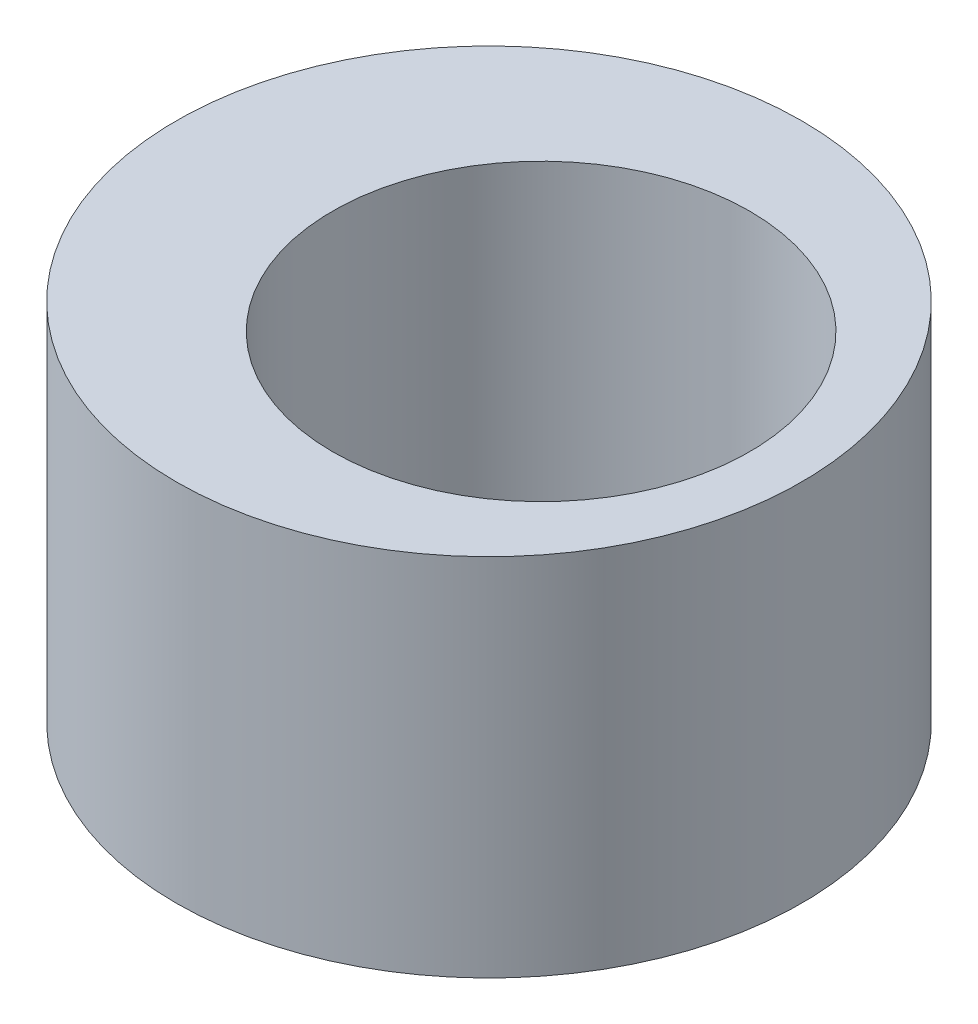
ISO-10303-21;
HEADER;
FILE_DESCRIPTION(('STEP AP214'),'2;1');
FILE_NAME('part.step','',(''),(''),'','','');
FILE_SCHEMA(('AUTOMOTIVE_DESIGN { 1 0 10303 214 1 1 1 1 }'));
ENDSEC;
DATA;
#1=APPLICATION_CONTEXT('core data for automotive mechanical design processes');
#2=APPLICATION_PROTOCOL_DEFINITION('international standard','automotive_design',2000,#1);
#3=PRODUCT_CONTEXT('',#1,'mechanical');
#4=PRODUCT('Part','Part','',(#3));
#5=PRODUCT_RELATED_PRODUCT_CATEGORY('part','',(#4));
#6=PRODUCT_DEFINITION_FORMATION('','',#4);
#7=PRODUCT_DEFINITION_CONTEXT('part definition',#1,'design');
#8=PRODUCT_DEFINITION('design','',#6,#7);
#9=PRODUCT_DEFINITION_SHAPE('','',#8);
#10=(LENGTH_UNIT() NAMED_UNIT(*) SI_UNIT(.MILLI.,.METRE.));
#11=(NAMED_UNIT(*) PLANE_ANGLE_UNIT() SI_UNIT($,.RADIAN.));
#12=(NAMED_UNIT(*) SI_UNIT($,.STERADIAN.) SOLID_ANGLE_UNIT());
#13=UNCERTAINTY_MEASURE_WITH_UNIT(LENGTH_MEASURE(1.E-05),#10,'distance_accuracy_value','');
#14=(GEOMETRIC_REPRESENTATION_CONTEXT(3) GLOBAL_UNCERTAINTY_ASSIGNED_CONTEXT((#13)) GLOBAL_UNIT_ASSIGNED_CONTEXT((#10,
#11,#12)) REPRESENTATION_CONTEXT('',''));
#15=CARTESIAN_POINT('',(0.,0.,0.));
#16=DIRECTION('',(0.,0.,1.));
#17=DIRECTION('',(1.,0.,0.));
#18=AXIS2_PLACEMENT_3D('',#15,#16,#17);
#19=CARTESIAN_POINT('',(0.,7.,0.));
#20=DIRECTION('',(0.,1.,0.));
#21=DIRECTION('',(0.,0.,1.));
#22=AXIS2_PLACEMENT_3D('',#19,#20,#21);
#23=PLANE('',#22);
#24=CARTESIAN_POINT('',(0.,7.,0.));
#25=DIRECTION('',(0.,1.,0.));
#26=DIRECTION('',(0.,0.,1.));
#27=AXIS2_PLACEMENT_3D('',#24,#25,#26);
#28=CIRCLE('',#27,6.);
#29=CARTESIAN_POINT('',(0.,7.,6.));
#30=VERTEX_POINT('',#29);
#31=EDGE_CURVE('E10',#30,#30,#28,.T.);
#32=ORIENTED_EDGE('',*,*,#31,.T.);
#33=EDGE_LOOP('',(#32));
#34=FACE_BOUND('',#33,.T.);
#35=CARTESIAN_POINT('',(1.,7.,0.));
#36=DIRECTION('',(0.,1.,0.));
#37=DIRECTION('',(0.,0.,1.));
#38=AXIS2_PLACEMENT_3D('',#35,#36,#37);
#39=CIRCLE('',#38,4.);
#40=CARTESIAN_POINT('',(1.,7.,4.));
#41=VERTEX_POINT('',#40);
#42=EDGE_CURVE('E42',#41,#41,#39,.T.);
#43=ORIENTED_EDGE('',*,*,#42,.F.);
#44=EDGE_LOOP('',(#43));
#45=FACE_BOUND('',#44,.T.);
#46=ADVANCED_FACE('F31',(#34,#45),#23,.T.);
#47=CARTESIAN_POINT('',(0.,0.,0.));
#48=DIRECTION('',(0.,1.,0.));
#49=DIRECTION('',(0.,0.,1.));
#50=AXIS2_PLACEMENT_3D('',#47,#48,#49);
#51=PLANE('',#50);
#52=CARTESIAN_POINT('',(0.,0.,0.));
#53=DIRECTION('',(0.,1.,0.));
#54=DIRECTION('',(0.,0.,1.));
#55=AXIS2_PLACEMENT_3D('',#52,#53,#54);
#56=CIRCLE('',#55,6.);
#57=CARTESIAN_POINT('',(0.,0.,6.));
#58=VERTEX_POINT('',#57);
#59=EDGE_CURVE('E35',#58,#58,#56,.T.);
#60=ORIENTED_EDGE('',*,*,#59,.F.);
#61=EDGE_LOOP('',(#60));
#62=FACE_BOUND('',#61,.T.);
#63=CARTESIAN_POINT('',(1.,0.,0.));
#64=DIRECTION('',(0.,1.,0.));
#65=DIRECTION('',(0.,0.,1.));
#66=AXIS2_PLACEMENT_3D('',#63,#64,#65);
#67=CIRCLE('',#66,4.);
#68=CARTESIAN_POINT('',(1.,0.,4.));
#69=VERTEX_POINT('',#68);
#70=EDGE_CURVE('E44',#69,#69,#67,.T.);
#71=ORIENTED_EDGE('',*,*,#70,.T.);
#72=EDGE_LOOP('',(#71));
#73=FACE_BOUND('',#72,.T.);
#74=ADVANCED_FACE('F54',(#62,#73),#51,.F.);
#75=CARTESIAN_POINT('',(0.,7.,0.));
#76=DIRECTION('',(0.,-1.,0.));
#77=DIRECTION('',(0.,0.,-1.));
#78=AXIS2_PLACEMENT_3D('',#75,#76,#77);
#79=CYLINDRICAL_SURFACE('',#78,6.);
#80=ORIENTED_EDGE('',*,*,#31,.F.);
#81=EDGE_LOOP('',(#80));
#82=FACE_BOUND('',#81,.T.);
#83=ORIENTED_EDGE('',*,*,#59,.T.);
#84=EDGE_LOOP('',(#83));
#85=FACE_BOUND('',#84,.T.);
#86=ADVANCED_FACE('F33',(#82,#85),#79,.T.);
#87=CARTESIAN_POINT('',(1.,7.,0.));
#88=DIRECTION('',(0.,-1.,0.));
#89=DIRECTION('',(0.,0.,-1.));
#90=AXIS2_PLACEMENT_3D('',#87,#88,#89);
#91=CYLINDRICAL_SURFACE('',#90,4.);
#92=ORIENTED_EDGE('',*,*,#42,.T.);
#93=EDGE_LOOP('',(#92));
#94=FACE_BOUND('',#93,.T.);
#95=ORIENTED_EDGE('',*,*,#70,.F.);
#96=EDGE_LOOP('',(#95));
#97=FACE_BOUND('',#96,.T.);
#98=ADVANCED_FACE('F50',(#94,#97),#91,.F.);
#99=CLOSED_SHELL('',(#46,#74,#86,#98));
#100=MANIFOLD_SOLID_BREP('B2',#99);
#101=ADVANCED_BREP_SHAPE_REPRESENTATION('',(#18,#100),#14);
#102=SHAPE_DEFINITION_REPRESENTATION(#9,#101);
ENDSEC;
END-ISO-10303-21;
